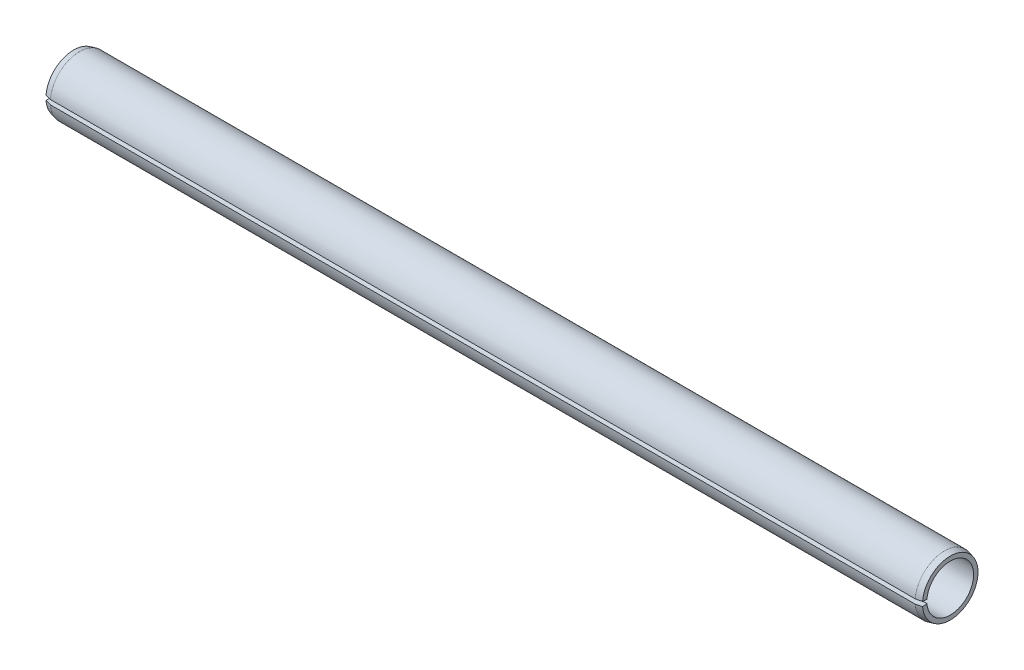
ISO-10303-21;
HEADER;
FILE_DESCRIPTION(('STEP AP214'),'2;1');
FILE_NAME('part.step','',(''),(''),'','','');
FILE_SCHEMA(('AUTOMOTIVE_DESIGN { 1 0 10303 214 1 1 1 1 }'));
ENDSEC;
DATA;
#1=APPLICATION_CONTEXT('core data for automotive mechanical design processes');
#2=APPLICATION_PROTOCOL_DEFINITION('international standard','automotive_design',2000,#1);
#3=PRODUCT_CONTEXT('',#1,'mechanical');
#4=PRODUCT('Part','Part','',(#3));
#5=PRODUCT_RELATED_PRODUCT_CATEGORY('part','',(#4));
#6=PRODUCT_DEFINITION_FORMATION('','',#4);
#7=PRODUCT_DEFINITION_CONTEXT('part definition',#1,'design');
#8=PRODUCT_DEFINITION('design','',#6,#7);
#9=PRODUCT_DEFINITION_SHAPE('','',#8);
#10=(LENGTH_UNIT() NAMED_UNIT(*) SI_UNIT(.MILLI.,.METRE.));
#11=(NAMED_UNIT(*) PLANE_ANGLE_UNIT() SI_UNIT($,.RADIAN.));
#12=(NAMED_UNIT(*) SI_UNIT($,.STERADIAN.) SOLID_ANGLE_UNIT());
#13=UNCERTAINTY_MEASURE_WITH_UNIT(LENGTH_MEASURE(1.E-05),#10,'distance_accuracy_value','');
#14=(GEOMETRIC_REPRESENTATION_CONTEXT(3) GLOBAL_UNCERTAINTY_ASSIGNED_CONTEXT((#13)) GLOBAL_UNIT_ASSIGNED_CONTEXT((#10,
#11,#12)) REPRESENTATION_CONTEXT('',''));
#15=CARTESIAN_POINT('',(0.,0.,0.));
#16=DIRECTION('',(0.,0.,1.));
#17=DIRECTION('',(1.,0.,0.));
#18=AXIS2_PLACEMENT_3D('',#15,#16,#17);
#19=CARTESIAN_POINT('',(0.,0.95,0.));
#20=DIRECTION('',(1.,0.,0.));
#21=DIRECTION('',(0.,0.,-1.));
#22=AXIS2_PLACEMENT_3D('',#19,#20,#21);
#23=PLANE('',#22);
#24=DIRECTION('',(0.,0.0784590957278457,0.996917333733128));
#25=VECTOR('',#24,1.);
#26=CARTESIAN_POINT('',(0.,0.,0.));
#27=LINE('',#26,#25);
#28=CARTESIAN_POINT('',(0.,0.0627672765822765,0.797533866986502));
#29=VERTEX_POINT('',#28);
#30=CARTESIAN_POINT('',(0.,0.0745361409414534,0.947071467046471));
#31=VERTEX_POINT('',#30);
#32=EDGE_CURVE('E82',#29,#31,#27,.T.);
#33=ORIENTED_EDGE('',*,*,#32,.T.);
#34=CARTESIAN_POINT('',(0.,0.,0.));
#35=DIRECTION('',(-1.,0.,0.));
#36=DIRECTION('',(0.,0.,1.));
#37=AXIS2_PLACEMENT_3D('',#34,#35,#36);
#38=CIRCLE('',#37,0.95);
#39=CARTESIAN_POINT('',(0.,-0.0745361409414534,0.947071467046471));
#40=VERTEX_POINT('',#39);
#41=EDGE_CURVE('E100',#31,#40,#38,.T.);
#42=ORIENTED_EDGE('',*,*,#41,.T.);
#43=DIRECTION('',(0.,-0.0784590957278457,0.996917333733128));
#44=VECTOR('',#43,1.);
#45=CARTESIAN_POINT('',(0.,0.,0.));
#46=LINE('',#45,#44);
#47=CARTESIAN_POINT('',(0.,-0.0627672765822765,0.797533866986502));
#48=VERTEX_POINT('',#47);
#49=EDGE_CURVE('E54',#48,#40,#46,.T.);
#50=ORIENTED_EDGE('',*,*,#49,.F.);
#51=CARTESIAN_POINT('',(0.,0.,0.));
#52=DIRECTION('',(-1.,0.,0.));
#53=DIRECTION('',(0.,0.,1.));
#54=AXIS2_PLACEMENT_3D('',#51,#52,#53);
#55=CIRCLE('',#54,0.799999999999999);
#56=EDGE_CURVE('E97',#29,#48,#55,.T.);
#57=ORIENTED_EDGE('',*,*,#56,.F.);
#58=EDGE_LOOP('',(#33,#42,#50,#57));
#59=FACE_BOUND('',#58,.T.);
#60=ADVANCED_FACE('F33',(#59),#23,.F.);
#61=CARTESIAN_POINT('',(-9.52499999999999,0.,0.));
#62=DIRECTION('',(-1.,0.,0.));
#63=DIRECTION('',(0.,0.,1.));
#64=AXIS2_PLACEMENT_3D('',#61,#62,#63);
#65=CYLINDRICAL_SURFACE('',#64,0.799999999999999);
#66=DIRECTION('',(-1.,0.,0.));
#67=VECTOR('',#66,1.);
#68=CARTESIAN_POINT('',(-9.52499999999999,0.0627672765822765,0.797533866986502));
#69=LINE('',#68,#67);
#70=CARTESIAN_POINT('',(30.,0.0627672765822766,0.797533866986503));
#71=VERTEX_POINT('',#70);
#72=EDGE_CURVE('E85',#29,#71,#69,.F.);
#73=ORIENTED_EDGE('',*,*,#72,.F.);
#74=ORIENTED_EDGE('',*,*,#56,.T.);
#75=DIRECTION('',(-1.,0.,0.));
#76=VECTOR('',#75,1.);
#77=CARTESIAN_POINT('',(-9.52499999999999,-0.0627672765822765,0.797533866986502));
#78=LINE('',#77,#76);
#79=CARTESIAN_POINT('',(30.,-0.0627672765822766,0.797533866986503));
#80=VERTEX_POINT('',#79);
#81=EDGE_CURVE('E118',#48,#80,#78,.F.);
#82=ORIENTED_EDGE('',*,*,#81,.T.);
#83=CARTESIAN_POINT('',(30.,0.,0.));
#84=DIRECTION('',(-1.,0.,0.));
#85=DIRECTION('',(0.,0.,1.));
#86=AXIS2_PLACEMENT_3D('',#83,#84,#85);
#87=CIRCLE('',#86,0.8);
#88=EDGE_CURVE('E99',#71,#80,#87,.T.);
#89=ORIENTED_EDGE('',*,*,#88,.F.);
#90=EDGE_LOOP('',(#73,#74,#82,#89));
#91=FACE_BOUND('',#90,.T.);
#92=ADVANCED_FACE('F95',(#91),#65,.F.);
#93=CARTESIAN_POINT('',(30.,0.8,0.));
#94=DIRECTION('',(-1.,0.,0.));
#95=DIRECTION('',(0.,0.,1.));
#96=AXIS2_PLACEMENT_3D('',#93,#94,#95);
#97=PLANE('',#96);
#98=DIRECTION('',(0.,0.0784590957278457,0.996917333733128));
#99=VECTOR('',#98,1.);
#100=CARTESIAN_POINT('',(30.,0.,0.));
#101=LINE('',#100,#99);
#102=CARTESIAN_POINT('',(30.,0.0745361409414534,0.947071467046472));
#103=VERTEX_POINT('',#102);
#104=EDGE_CURVE('E127',#71,#103,#101,.T.);
#105=ORIENTED_EDGE('',*,*,#104,.F.);
#106=ORIENTED_EDGE('',*,*,#88,.T.);
#107=DIRECTION('',(0.,-0.0784590957278457,0.996917333733128));
#108=VECTOR('',#107,1.);
#109=CARTESIAN_POINT('',(30.,0.,0.));
#110=LINE('',#109,#108);
#111=CARTESIAN_POINT('',(30.,-0.0745361409414534,0.947071467046472));
#112=VERTEX_POINT('',#111);
#113=EDGE_CURVE('E126',#80,#112,#110,.T.);
#114=ORIENTED_EDGE('',*,*,#113,.T.);
#115=CARTESIAN_POINT('',(30.,0.,0.));
#116=DIRECTION('',(-1.,0.,0.));
#117=DIRECTION('',(0.,0.,1.));
#118=AXIS2_PLACEMENT_3D('',#115,#116,#117);
#119=CIRCLE('',#118,0.95);
#120=EDGE_CURVE('E104',#103,#112,#119,.T.);
#121=ORIENTED_EDGE('',*,*,#120,.F.);
#122=EDGE_LOOP('',(#105,#106,#114,#121));
#123=FACE_BOUND('',#122,.T.);
#124=ADVANCED_FACE('F137',(#123),#97,.F.);
#125=CARTESIAN_POINT('',(30.,0.,0.));
#126=DIRECTION('',(-1.,0.,0.));
#127=DIRECTION('',(0.,0.,1.));
#128=AXIS2_PLACEMENT_3D('',#125,#126,#127);
#129=CONICAL_SURFACE('',#128,0.95,0.244978663126883);
#130=DIRECTION('',(-0.970142500145328,0.01902912582214,0.241787968646537));
#131=VECTOR('',#130,1.);
#132=CARTESIAN_POINT('',(33.7999999999997,0.,0.));
#133=LINE('',#132,#131);
#134=CARTESIAN_POINT('',(29.8,0.0784590957278458,0.996917333733129));
#135=VERTEX_POINT('',#134);
#136=EDGE_CURVE('E101',#103,#135,#133,.T.);
#137=ORIENTED_EDGE('',*,*,#136,.F.);
#138=ORIENTED_EDGE('',*,*,#120,.T.);
#139=DIRECTION('',(-0.970142500145328,-0.01902912582214,0.241787968646537));
#140=VECTOR('',#139,1.);
#141=CARTESIAN_POINT('',(33.7999999999997,0.,0.));
#142=LINE('',#141,#140);
#143=CARTESIAN_POINT('',(29.8,-0.0784590957278458,0.996917333733129));
#144=VERTEX_POINT('',#143);
#145=EDGE_CURVE('E120',#112,#144,#142,.T.);
#146=ORIENTED_EDGE('',*,*,#145,.T.);
#147=CARTESIAN_POINT('',(29.8,0.,0.));
#148=DIRECTION('',(-1.,0.,0.));
#149=DIRECTION('',(0.,0.,1.));
#150=AXIS2_PLACEMENT_3D('',#147,#148,#149);
#151=CIRCLE('',#150,1.);
#152=EDGE_CURVE('E109',#135,#144,#151,.T.);
#153=ORIENTED_EDGE('',*,*,#152,.F.);
#154=EDGE_LOOP('',(#137,#138,#146,#153));
#155=FACE_BOUND('',#154,.T.);
#156=ADVANCED_FACE('F136',(#155),#129,.T.);
#157=CARTESIAN_POINT('',(-9.52499999999999,0.,0.));
#158=DIRECTION('',(-1.,0.,0.));
#159=DIRECTION('',(0.,0.,1.));
#160=AXIS2_PLACEMENT_3D('',#157,#158,#159);
#161=CYLINDRICAL_SURFACE('',#160,1.);
#162=DIRECTION('',(-1.,0.,0.));
#163=VECTOR('',#162,1.);
#164=CARTESIAN_POINT('',(-9.52499999999999,0.0784590957278458,0.996917333733129));
#165=LINE('',#164,#163);
#166=CARTESIAN_POINT('',(0.200000000000001,0.0784590957278456,0.996917333733127));
#167=VERTEX_POINT('',#166);
#168=EDGE_CURVE('E46',#135,#167,#165,.T.);
#169=ORIENTED_EDGE('',*,*,#168,.F.);
#170=ORIENTED_EDGE('',*,*,#152,.T.);
#171=DIRECTION('',(-1.,0.,0.));
#172=VECTOR('',#171,1.);
#173=CARTESIAN_POINT('',(-9.52499999999999,-0.0784590957278458,0.996917333733129));
#174=LINE('',#173,#172);
#175=CARTESIAN_POINT('',(0.200000000000001,-0.0784590957278456,0.996917333733127));
#176=VERTEX_POINT('',#175);
#177=EDGE_CURVE('E123',#144,#176,#174,.T.);
#178=ORIENTED_EDGE('',*,*,#177,.T.);
#179=CARTESIAN_POINT('',(0.200000000000001,0.,0.));
#180=DIRECTION('',(-1.,0.,0.));
#181=DIRECTION('',(0.,0.,1.));
#182=AXIS2_PLACEMENT_3D('',#179,#180,#181);
#183=CIRCLE('',#182,0.999999999999999);
#184=EDGE_CURVE('E112',#167,#176,#183,.T.);
#185=ORIENTED_EDGE('',*,*,#184,.F.);
#186=EDGE_LOOP('',(#169,#170,#178,#185));
#187=FACE_BOUND('',#186,.T.);
#188=ADVANCED_FACE('F140',(#187),#161,.T.);
#189=CARTESIAN_POINT('',(0.200000000000001,0.,0.));
#190=DIRECTION('',(1.,0.,0.));
#191=DIRECTION('',(0.,0.,-1.));
#192=AXIS2_PLACEMENT_3D('',#189,#190,#191);
#193=CONICAL_SURFACE('',#192,0.999999999999999,0.244978663126862);
#194=DIRECTION('',(-0.970142500145333,-0.0190291258221384,-0.241787968646517));
#195=VECTOR('',#194,1.);
#196=CARTESIAN_POINT('',(-3.80000000000003,0.,0.));
#197=LINE('',#196,#195);
#198=EDGE_CURVE('E11',#167,#31,#197,.T.);
#199=ORIENTED_EDGE('',*,*,#198,.F.);
#200=ORIENTED_EDGE('',*,*,#184,.T.);
#201=DIRECTION('',(-0.970142500145333,0.0190291258221384,-0.241787968646517));
#202=VECTOR('',#201,1.);
#203=CARTESIAN_POINT('',(-3.80000000000003,0.,0.));
#204=LINE('',#203,#202);
#205=EDGE_CURVE('E40',#176,#40,#204,.T.);
#206=ORIENTED_EDGE('',*,*,#205,.T.);
#207=ORIENTED_EDGE('',*,*,#41,.F.);
#208=EDGE_LOOP('',(#199,#200,#206,#207));
#209=FACE_BOUND('',#208,.T.);
#210=ADVANCED_FACE('F143',(#209),#193,.T.);
#211=CARTESIAN_POINT('',(30.,0.,0.));
#212=DIRECTION('',(0.,-0.996917333733128,-0.0784590957278457));
#213=DIRECTION('',(0.,0.0784590957278457,-0.996917333733128));
#214=AXIS2_PLACEMENT_3D('',#211,#212,#213);
#215=PLANE('',#214);
#216=ORIENTED_EDGE('',*,*,#49,.T.);
#217=ORIENTED_EDGE('',*,*,#205,.F.);
#218=ORIENTED_EDGE('',*,*,#177,.F.);
#219=ORIENTED_EDGE('',*,*,#145,.F.);
#220=ORIENTED_EDGE('',*,*,#113,.F.);
#221=ORIENTED_EDGE('',*,*,#81,.F.);
#222=EDGE_LOOP('',(#216,#217,#218,#219,#220,#221));
#223=FACE_BOUND('',#222,.T.);
#224=ADVANCED_FACE('F138',(#223),#215,.F.);
#225=CARTESIAN_POINT('',(30.,0.,0.));
#226=DIRECTION('',(0.,-0.996917333733128,0.0784590957278457));
#227=DIRECTION('',(0.,-0.0784590957278457,-0.996917333733128));
#228=AXIS2_PLACEMENT_3D('',#225,#226,#227);
#229=PLANE('',#228);
#230=ORIENTED_EDGE('',*,*,#72,.T.);
#231=ORIENTED_EDGE('',*,*,#104,.T.);
#232=ORIENTED_EDGE('',*,*,#136,.T.);
#233=ORIENTED_EDGE('',*,*,#168,.T.);
#234=ORIENTED_EDGE('',*,*,#198,.T.);
#235=ORIENTED_EDGE('',*,*,#32,.F.);
#236=EDGE_LOOP('',(#230,#231,#232,#233,#234,#235));
#237=FACE_BOUND('',#236,.T.);
#238=ADVANCED_FACE('F84',(#237),#229,.T.);
#239=CLOSED_SHELL('',(#60,#92,#124,#156,#188,#210,#224,#238));
#240=MANIFOLD_SOLID_BREP('B2',#239);
#241=ADVANCED_BREP_SHAPE_REPRESENTATION('',(#18,#240),#14);
#242=SHAPE_DEFINITION_REPRESENTATION(#9,#241);
ENDSEC;
END-ISO-10303-21;
